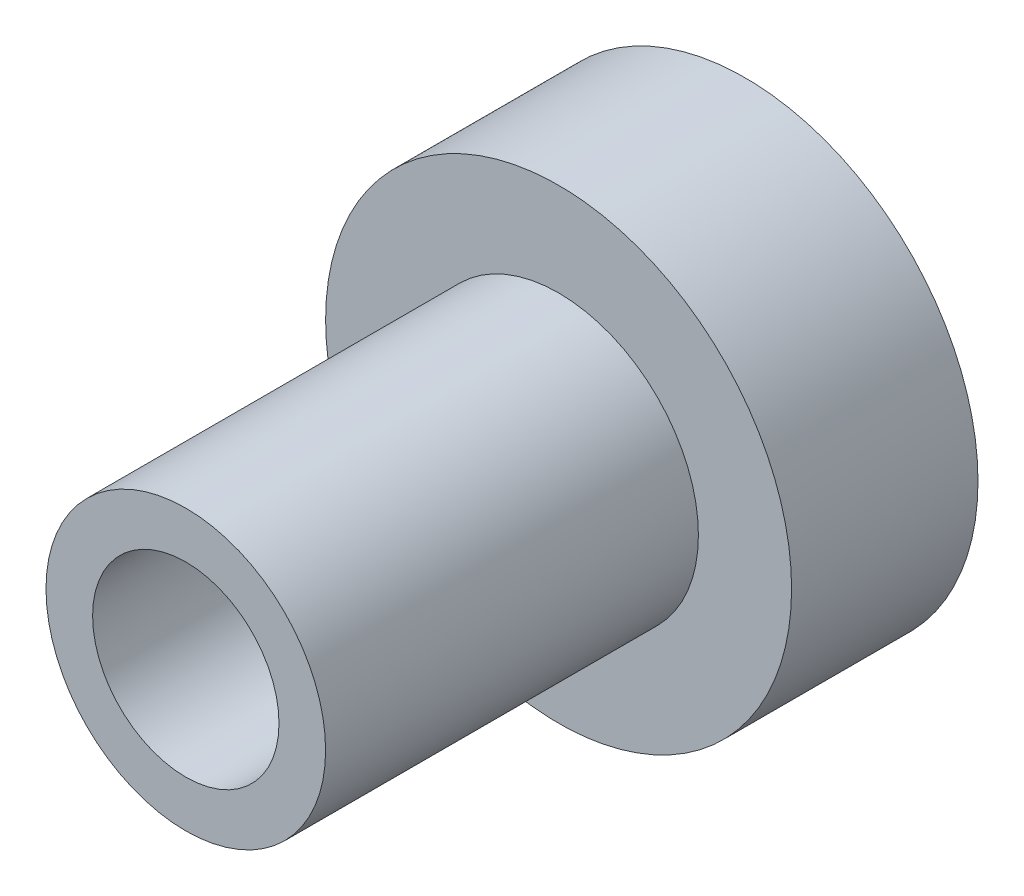
ISO-10303-21;
HEADER;
FILE_DESCRIPTION(('STEP AP214'),'2;1');
FILE_NAME('part.step','',(''),(''),'','','');
FILE_SCHEMA(('AUTOMOTIVE_DESIGN { 1 0 10303 214 1 1 1 1 }'));
ENDSEC;
DATA;
#1=APPLICATION_CONTEXT('core data for automotive mechanical design processes');
#2=APPLICATION_PROTOCOL_DEFINITION('international standard','automotive_design',2000,#1);
#3=PRODUCT_CONTEXT('',#1,'mechanical');
#4=PRODUCT('Part','Part','',(#3));
#5=PRODUCT_RELATED_PRODUCT_CATEGORY('part','',(#4));
#6=PRODUCT_DEFINITION_FORMATION('','',#4);
#7=PRODUCT_DEFINITION_CONTEXT('part definition',#1,'design');
#8=PRODUCT_DEFINITION('design','',#6,#7);
#9=PRODUCT_DEFINITION_SHAPE('','',#8);
#10=(LENGTH_UNIT() NAMED_UNIT(*) SI_UNIT(.MILLI.,.METRE.));
#11=(NAMED_UNIT(*) PLANE_ANGLE_UNIT() SI_UNIT($,.RADIAN.));
#12=(NAMED_UNIT(*) SI_UNIT($,.STERADIAN.) SOLID_ANGLE_UNIT());
#13=UNCERTAINTY_MEASURE_WITH_UNIT(LENGTH_MEASURE(1.E-05),#10,'distance_accuracy_value','');
#14=(GEOMETRIC_REPRESENTATION_CONTEXT(3) GLOBAL_UNCERTAINTY_ASSIGNED_CONTEXT((#13)) GLOBAL_UNIT_ASSIGNED_CONTEXT((#10,
#11,#12)) REPRESENTATION_CONTEXT('',''));
#15=CARTESIAN_POINT('',(0.,0.,0.));
#16=DIRECTION('',(0.,0.,1.));
#17=DIRECTION('',(1.,0.,0.));
#18=AXIS2_PLACEMENT_3D('',#15,#16,#17);
#19=CARTESIAN_POINT('',(0.,0.,20.));
#20=DIRECTION('',(0.,0.,-1.));
#21=DIRECTION('',(-1.,0.,0.));
#22=AXIS2_PLACEMENT_3D('',#19,#20,#21);
#23=CYLINDRICAL_SURFACE('',#22,25.);
#24=CARTESIAN_POINT('',(0.,0.,20.));
#25=DIRECTION('',(0.,0.,1.));
#26=DIRECTION('',(1.,0.,0.));
#27=AXIS2_PLACEMENT_3D('',#24,#25,#26);
#28=CIRCLE('',#27,25.);
#29=CARTESIAN_POINT('',(-25.,0.,20.));
#30=VERTEX_POINT('',#29);
#31=EDGE_CURVE('E38',#30,#30,#28,.T.);
#32=CARTESIAN_POINT('',(0.,0.,0.));
#33=DIRECTION('',(0.,0.,1.));
#34=DIRECTION('',(1.,0.,0.));
#35=AXIS2_PLACEMENT_3D('',#32,#33,#34);
#36=CIRCLE('',#35,25.);
#37=CARTESIAN_POINT('',(-25.,0.,0.));
#38=VERTEX_POINT('',#37);
#39=EDGE_CURVE('E42',#38,#38,#36,.T.);
#40=CARTESIAN_POINT('',(-25.,0.,20.));
#41=CARTESIAN_POINT('',(-25.,0.,19.7916666666667));
#42=CARTESIAN_POINT('',(-25.,0.,19.5833333333333));
#43=CARTESIAN_POINT('',(-25.,0.,19.1666666666667));
#44=CARTESIAN_POINT('',(-25.,0.,18.9583333333333));
#45=CARTESIAN_POINT('',(-25.,0.,18.5416666666667));
#46=CARTESIAN_POINT('',(-25.,0.,18.3333333333333));
#47=CARTESIAN_POINT('',(-25.,0.,17.9166666666667));
#48=CARTESIAN_POINT('',(-25.,0.,17.7083333333333));
#49=CARTESIAN_POINT('',(-25.,0.,17.2916666666667));
#50=CARTESIAN_POINT('',(-25.,0.,17.0833333333333));
#51=CARTESIAN_POINT('',(-25.,0.,16.6666666666667));
#52=CARTESIAN_POINT('',(-25.,0.,16.4583333333333));
#53=CARTESIAN_POINT('',(-25.,0.,16.0416666666667));
#54=CARTESIAN_POINT('',(-25.,0.,15.8333333333333));
#55=CARTESIAN_POINT('',(-25.,0.,15.4166666666667));
#56=CARTESIAN_POINT('',(-25.,0.,15.2083333333333));
#57=CARTESIAN_POINT('',(-25.,0.,14.7916666666667));
#58=CARTESIAN_POINT('',(-25.,0.,14.5833333333333));
#59=CARTESIAN_POINT('',(-25.,0.,14.1666666666667));
#60=CARTESIAN_POINT('',(-25.,0.,13.9583333333333));
#61=CARTESIAN_POINT('',(-25.,0.,13.5416666666667));
#62=CARTESIAN_POINT('',(-25.,0.,13.3333333333333));
#63=CARTESIAN_POINT('',(-25.,0.,12.9166666666667));
#64=CARTESIAN_POINT('',(-25.,0.,12.7083333333333));
#65=CARTESIAN_POINT('',(-25.,0.,12.2916666666667));
#66=CARTESIAN_POINT('',(-25.,0.,12.0833333333333));
#67=CARTESIAN_POINT('',(-25.,0.,11.6666666666667));
#68=CARTESIAN_POINT('',(-25.,0.,11.4583333333333));
#69=CARTESIAN_POINT('',(-25.,0.,11.0416666666667));
#70=CARTESIAN_POINT('',(-25.,0.,10.8333333333333));
#71=CARTESIAN_POINT('',(-25.,0.,10.4166666666667));
#72=CARTESIAN_POINT('',(-25.,0.,10.2083333333333));
#73=CARTESIAN_POINT('',(-25.,0.,9.79166666666667));
#74=CARTESIAN_POINT('',(-25.,0.,9.58333333333334));
#75=CARTESIAN_POINT('',(-25.,0.,9.16666666666667));
#76=CARTESIAN_POINT('',(-25.,0.,8.95833333333334));
#77=CARTESIAN_POINT('',(-25.,0.,8.54166666666667));
#78=CARTESIAN_POINT('',(-25.,0.,8.33333333333334));
#79=CARTESIAN_POINT('',(-25.,0.,7.91666666666667));
#80=CARTESIAN_POINT('',(-25.,0.,7.70833333333334));
#81=CARTESIAN_POINT('',(-25.,0.,7.29166666666667));
#82=CARTESIAN_POINT('',(-25.,0.,7.08333333333334));
#83=CARTESIAN_POINT('',(-25.,0.,6.66666666666667));
#84=CARTESIAN_POINT('',(-25.,0.,6.45833333333334));
#85=CARTESIAN_POINT('',(-25.,0.,6.04166666666667));
#86=CARTESIAN_POINT('',(-25.,0.,5.83333333333334));
#87=CARTESIAN_POINT('',(-25.,0.,5.41666666666667));
#88=CARTESIAN_POINT('',(-25.,0.,5.20833333333333));
#89=CARTESIAN_POINT('',(-25.,0.,4.79166666666667));
#90=CARTESIAN_POINT('',(-25.,0.,4.58333333333333));
#91=CARTESIAN_POINT('',(-25.,0.,4.16666666666667));
#92=CARTESIAN_POINT('',(-25.,0.,3.95833333333333));
#93=CARTESIAN_POINT('',(-25.,0.,3.54166666666667));
#94=CARTESIAN_POINT('',(-25.,0.,3.33333333333334));
#95=CARTESIAN_POINT('',(-25.,0.,2.91666666666667));
#96=CARTESIAN_POINT('',(-25.,0.,2.70833333333334));
#97=CARTESIAN_POINT('',(-25.,0.,2.29166666666667));
#98=CARTESIAN_POINT('',(-25.,0.,2.08333333333334));
#99=CARTESIAN_POINT('',(-25.,0.,1.66666666666667));
#100=CARTESIAN_POINT('',(-25.,0.,1.45833333333333));
#101=CARTESIAN_POINT('',(-25.,0.,1.04166666666667));
#102=CARTESIAN_POINT('',(-25.,0.,0.833333333333334));
#103=CARTESIAN_POINT('',(-25.,0.,0.416666666666667));
#104=CARTESIAN_POINT('',(-25.,0.,0.208333333333334));
#105=CARTESIAN_POINT('',(-25.,0.,0.));
#106=B_SPLINE_CURVE_WITH_KNOTS('',3,(#40,#41,#42,#43,#44,#45,#46,#47,#48,#49,#50,#51,#52,#53,
#54,#55,#56,#57,#58,#59,#60,#61,#62,#63,#64,#65,#66,#67,#68,#69,#70,#71,#72,#73,#74,#75,#76,#77,
#78,#79,#80,#81,#82,#83,#84,#85,#86,#87,#88,#89,#90,#91,#92,#93,#94,#95,#96,#97,#98,#99,#100,
#101,#102,#103,#104,#105),.UNSPECIFIED.,.F.,.F.,(4,2,2,2,2,2,2,2,2,2,2,2,2,2,2,2,2,2,2,2,2,2,2,
2,2,2,2,2,2,2,2,2,4),(0.,0.624999999999997,1.25,1.875,2.5,3.125,3.75,4.375,5.,5.625,6.25,6.875,
7.5,8.125,8.75,9.375,10.,10.625,11.25,11.875,12.5,13.125,13.75,14.375,15.,15.625,16.25,16.875,
17.5,18.125,18.75,19.375,20.),.UNSPECIFIED.);
#107=EDGE_CURVE('BSEAM32',#30,#38,#106,.T.);
#108=ORIENTED_EDGE('',*,*,#31,.F.);
#109=ORIENTED_EDGE('',*,*,#39,.T.);
#110=ORIENTED_EDGE('',*,*,#107,.T.);
#111=ORIENTED_EDGE('',*,*,#107,.F.);
#112=EDGE_LOOP('',(#108,#110,#109,#111));
#113=FACE_BOUND('',#112,.T.);
#114=ADVANCED_FACE('F32',(#113),#23,.T.);
#115=CARTESIAN_POINT('',(0.,0.,20.));
#116=DIRECTION('',(0.,0.,1.));
#117=DIRECTION('',(1.,0.,0.));
#118=AXIS2_PLACEMENT_3D('',#115,#116,#117);
#119=PLANE('',#118);
#120=CARTESIAN_POINT('',(0.,0.,20.));
#121=DIRECTION('',(0.,0.,1.));
#122=DIRECTION('',(1.,0.,0.));
#123=AXIS2_PLACEMENT_3D('',#120,#121,#122);
#124=CIRCLE('',#123,15.);
#125=CARTESIAN_POINT('',(15.,0.,20.));
#126=VERTEX_POINT('',#125);
#127=EDGE_CURVE('E10',#126,#126,#124,.T.);
#128=ORIENTED_EDGE('',*,*,#127,.F.);
#129=EDGE_LOOP('',(#128));
#130=FACE_BOUND('',#129,.T.);
#131=ORIENTED_EDGE('',*,*,#31,.T.);
#132=EDGE_LOOP('',(#131));
#133=FACE_BOUND('',#132,.T.);
#134=ADVANCED_FACE('F79',(#130,#133),#119,.T.);
#135=CARTESIAN_POINT('',(0.,0.,0.));
#136=DIRECTION('',(0.,0.,1.));
#137=DIRECTION('',(1.,0.,0.));
#138=AXIS2_PLACEMENT_3D('',#135,#136,#137);
#139=PLANE('',#138);
#140=ORIENTED_EDGE('',*,*,#39,.F.);
#141=EDGE_LOOP('',(#140));
#142=FACE_BOUND('',#141,.T.);
#143=ADVANCED_FACE('F74',(#142),#139,.F.);
#144=CARTESIAN_POINT('',(0.,0.,19.));
#145=DIRECTION('',(0.,0.,1.));
#146=DIRECTION('',(1.,0.,0.));
#147=AXIS2_PLACEMENT_3D('',#144,#145,#146);
#148=CYLINDRICAL_SURFACE('',#147,15.);
#149=ORIENTED_EDGE('',*,*,#127,.T.);
#150=EDGE_LOOP('',(#149));
#151=FACE_BOUND('',#150,.T.);
#152=CARTESIAN_POINT('',(0.,0.,60.));
#153=DIRECTION('',(0.,0.,1.));
#154=DIRECTION('',(1.,0.,0.));
#155=AXIS2_PLACEMENT_3D('',#152,#153,#154);
#156=CIRCLE('',#155,15.);
#157=CARTESIAN_POINT('',(15.,0.,60.));
#158=VERTEX_POINT('',#157);
#159=EDGE_CURVE('E47',#158,#158,#156,.T.);
#160=ORIENTED_EDGE('',*,*,#159,.F.);
#161=EDGE_LOOP('',(#160));
#162=FACE_BOUND('',#161,.T.);
#163=ADVANCED_FACE('F69',(#151,#162),#148,.T.);
#164=CARTESIAN_POINT('',(0.,0.,60.));
#165=DIRECTION('',(0.,0.,1.));
#166=DIRECTION('',(1.,0.,0.));
#167=AXIS2_PLACEMENT_3D('',#164,#165,#166);
#168=PLANE('',#167);
#169=CARTESIAN_POINT('',(0.,0.,60.));
#170=DIRECTION('',(0.,0.,1.));
#171=DIRECTION('',(1.,0.,0.));
#172=AXIS2_PLACEMENT_3D('',#169,#170,#171);
#173=CIRCLE('',#172,10.);
#174=CARTESIAN_POINT('',(10.,0.,60.));
#175=VERTEX_POINT('',#174);
#176=EDGE_CURVE('E52',#175,#175,#173,.T.);
#177=ORIENTED_EDGE('',*,*,#176,.F.);
#178=EDGE_LOOP('',(#177));
#179=FACE_BOUND('',#178,.T.);
#180=ORIENTED_EDGE('',*,*,#159,.T.);
#181=EDGE_LOOP('',(#180));
#182=FACE_BOUND('',#181,.T.);
#183=ADVANCED_FACE('F63',(#179,#182),#168,.T.);
#184=CARTESIAN_POINT('',(0.,0.,20.));
#185=DIRECTION('',(0.,0.,1.));
#186=DIRECTION('',(1.,0.,0.));
#187=AXIS2_PLACEMENT_3D('',#184,#185,#186);
#188=CYLINDRICAL_SURFACE('',#187,10.);
#189=CARTESIAN_POINT('',(0.,0.,20.));
#190=DIRECTION('',(0.,0.,1.));
#191=DIRECTION('',(1.,0.,0.));
#192=AXIS2_PLACEMENT_3D('',#189,#190,#191);
#193=CIRCLE('',#192,10.);
#194=CARTESIAN_POINT('',(10.,0.,20.));
#195=VERTEX_POINT('',#194);
#196=EDGE_CURVE('E51',#195,#195,#193,.T.);
#197=ORIENTED_EDGE('',*,*,#196,.F.);
#198=EDGE_LOOP('',(#197));
#199=FACE_BOUND('',#198,.T.);
#200=ORIENTED_EDGE('',*,*,#176,.T.);
#201=EDGE_LOOP('',(#200));
#202=FACE_BOUND('',#201,.T.);
#203=ADVANCED_FACE('F60',(#199,#202),#188,.F.);
#204=CARTESIAN_POINT('',(0.,0.,20.));
#205=DIRECTION('',(0.,0.,1.));
#206=DIRECTION('',(1.,0.,0.));
#207=AXIS2_PLACEMENT_3D('',#204,#205,#206);
#208=PLANE('',#207);
#209=ORIENTED_EDGE('',*,*,#196,.T.);
#210=EDGE_LOOP('',(#209));
#211=FACE_BOUND('',#210,.T.);
#212=ADVANCED_FACE('F58',(#211),#208,.T.);
#213=CLOSED_SHELL('',(#114,#134,#143,#163,#183,#203,#212));
#214=MANIFOLD_SOLID_BREP('B2',#213);
#215=ADVANCED_BREP_SHAPE_REPRESENTATION('',(#18,#214),#14);
#216=SHAPE_DEFINITION_REPRESENTATION(#9,#215);
ENDSEC;
END-ISO-10303-21;
